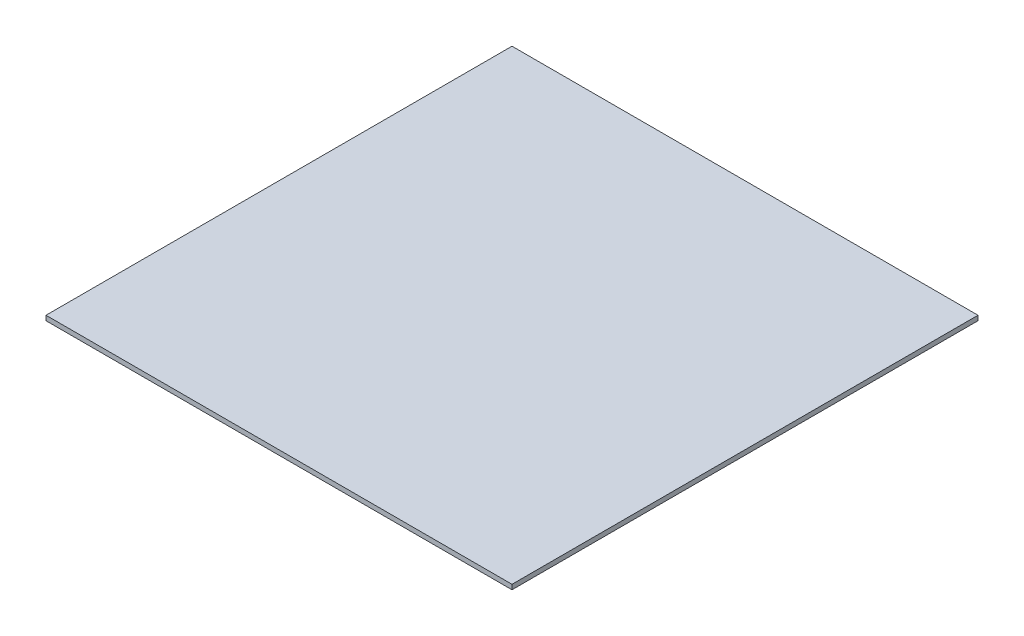
ISO-10303-21;
HEADER;
FILE_DESCRIPTION(('STEP AP214'),'2;1');
FILE_NAME('part.step','',(''),(''),'','','');
FILE_SCHEMA(('AUTOMOTIVE_DESIGN { 1 0 10303 214 1 1 1 1 }'));
ENDSEC;
DATA;
#1=APPLICATION_CONTEXT('core data for automotive mechanical design processes');
#2=APPLICATION_PROTOCOL_DEFINITION('international standard','automotive_design',2000,#1);
#3=PRODUCT_CONTEXT('',#1,'mechanical');
#4=PRODUCT('Part','Part','',(#3));
#5=PRODUCT_RELATED_PRODUCT_CATEGORY('part','',(#4));
#6=PRODUCT_DEFINITION_FORMATION('','',#4);
#7=PRODUCT_DEFINITION_CONTEXT('part definition',#1,'design');
#8=PRODUCT_DEFINITION('design','',#6,#7);
#9=PRODUCT_DEFINITION_SHAPE('','',#8);
#10=(LENGTH_UNIT() NAMED_UNIT(*) SI_UNIT(.MILLI.,.METRE.));
#11=(NAMED_UNIT(*) PLANE_ANGLE_UNIT() SI_UNIT($,.RADIAN.));
#12=(NAMED_UNIT(*) SI_UNIT($,.STERADIAN.) SOLID_ANGLE_UNIT());
#13=UNCERTAINTY_MEASURE_WITH_UNIT(LENGTH_MEASURE(1.E-05),#10,'distance_accuracy_value','');
#14=(GEOMETRIC_REPRESENTATION_CONTEXT(3) GLOBAL_UNCERTAINTY_ASSIGNED_CONTEXT((#13)) GLOBAL_UNIT_ASSIGNED_CONTEXT((#10,
#11,#12)) REPRESENTATION_CONTEXT('',''));
#15=CARTESIAN_POINT('',(0.,0.,0.));
#16=DIRECTION('',(0.,0.,1.));
#17=DIRECTION('',(1.,0.,0.));
#18=AXIS2_PLACEMENT_3D('',#15,#16,#17);
#19=CARTESIAN_POINT('',(-195.,4.,195.));
#20=DIRECTION('',(1.,0.,0.));
#21=DIRECTION('',(0.,0.,-1.));
#22=AXIS2_PLACEMENT_3D('',#19,#20,#21);
#23=PLANE('',#22);
#24=DIRECTION('',(0.,0.,1.));
#25=VECTOR('',#24,1.);
#26=CARTESIAN_POINT('',(-195.,0.,195.));
#27=LINE('',#26,#25);
#28=CARTESIAN_POINT('',(-195.,0.,-195.));
#29=VERTEX_POINT('',#28);
#30=CARTESIAN_POINT('',(-195.,0.,195.));
#31=VERTEX_POINT('',#30);
#32=EDGE_CURVE('E95',#29,#31,#27,.T.);
#33=ORIENTED_EDGE('',*,*,#32,.T.);
#34=DIRECTION('',(0.,-1.,0.));
#35=VECTOR('',#34,1.);
#36=CARTESIAN_POINT('',(-195.,4.,195.));
#37=LINE('',#36,#35);
#38=CARTESIAN_POINT('',(-195.,4.,195.));
#39=VERTEX_POINT('',#38);
#40=EDGE_CURVE('E11',#39,#31,#37,.T.);
#41=ORIENTED_EDGE('',*,*,#40,.F.);
#42=DIRECTION('',(0.,0.,1.));
#43=VECTOR('',#42,1.);
#44=CARTESIAN_POINT('',(-195.,4.,195.));
#45=LINE('',#44,#43);
#46=CARTESIAN_POINT('',(-195.,4.,-195.));
#47=VERTEX_POINT('',#46);
#48=EDGE_CURVE('E83',#47,#39,#45,.T.);
#49=ORIENTED_EDGE('',*,*,#48,.F.);
#50=DIRECTION('',(0.,-1.,0.));
#51=VECTOR('',#50,1.);
#52=CARTESIAN_POINT('',(-195.,4.,-195.));
#53=LINE('',#52,#51);
#54=EDGE_CURVE('E91',#47,#29,#53,.T.);
#55=ORIENTED_EDGE('',*,*,#54,.T.);
#56=EDGE_LOOP('',(#33,#41,#49,#55));
#57=FACE_BOUND('',#56,.T.);
#58=ADVANCED_FACE('F32',(#57),#23,.F.);
#59=CARTESIAN_POINT('',(195.,4.,195.));
#60=DIRECTION('',(0.,0.,-1.));
#61=DIRECTION('',(-1.,0.,0.));
#62=AXIS2_PLACEMENT_3D('',#59,#60,#61);
#63=PLANE('',#62);
#64=DIRECTION('',(1.,0.,0.));
#65=VECTOR('',#64,1.);
#66=CARTESIAN_POINT('',(195.,0.,195.));
#67=LINE('',#66,#65);
#68=CARTESIAN_POINT('',(195.,0.,195.));
#69=VERTEX_POINT('',#68);
#70=EDGE_CURVE('E87',#31,#69,#67,.T.);
#71=ORIENTED_EDGE('',*,*,#70,.T.);
#72=DIRECTION('',(0.,-1.,0.));
#73=VECTOR('',#72,1.);
#74=CARTESIAN_POINT('',(195.,4.,195.));
#75=LINE('',#74,#73);
#76=CARTESIAN_POINT('',(195.,4.,195.));
#77=VERTEX_POINT('',#76);
#78=EDGE_CURVE('E40',#77,#69,#75,.T.);
#79=ORIENTED_EDGE('',*,*,#78,.F.);
#80=DIRECTION('',(1.,0.,0.));
#81=VECTOR('',#80,1.);
#82=CARTESIAN_POINT('',(195.,4.,195.));
#83=LINE('',#82,#81);
#84=EDGE_CURVE('E78',#39,#77,#83,.T.);
#85=ORIENTED_EDGE('',*,*,#84,.F.);
#86=ORIENTED_EDGE('',*,*,#40,.T.);
#87=EDGE_LOOP('',(#71,#79,#85,#86));
#88=FACE_BOUND('',#87,.T.);
#89=ADVANCED_FACE('F86',(#88),#63,.F.);
#90=CARTESIAN_POINT('',(195.,4.,195.));
#91=DIRECTION('',(-1.,0.,0.));
#92=DIRECTION('',(0.,0.,1.));
#93=AXIS2_PLACEMENT_3D('',#90,#91,#92);
#94=PLANE('',#93);
#95=DIRECTION('',(0.,0.,-1.));
#96=VECTOR('',#95,1.);
#97=CARTESIAN_POINT('',(195.,0.,195.));
#98=LINE('',#97,#96);
#99=CARTESIAN_POINT('',(195.,0.,-195.));
#100=VERTEX_POINT('',#99);
#101=EDGE_CURVE('E65',#69,#100,#98,.T.);
#102=ORIENTED_EDGE('',*,*,#101,.T.);
#103=DIRECTION('',(0.,-1.,0.));
#104=VECTOR('',#103,1.);
#105=CARTESIAN_POINT('',(195.,4.,-195.));
#106=LINE('',#105,#104);
#107=CARTESIAN_POINT('',(195.,4.,-195.));
#108=VERTEX_POINT('',#107);
#109=EDGE_CURVE('E88',#108,#100,#106,.T.);
#110=ORIENTED_EDGE('',*,*,#109,.F.);
#111=DIRECTION('',(0.,0.,-1.));
#112=VECTOR('',#111,1.);
#113=CARTESIAN_POINT('',(195.,4.,195.));
#114=LINE('',#113,#112);
#115=EDGE_CURVE('E81',#77,#108,#114,.T.);
#116=ORIENTED_EDGE('',*,*,#115,.F.);
#117=ORIENTED_EDGE('',*,*,#78,.T.);
#118=EDGE_LOOP('',(#102,#110,#116,#117));
#119=FACE_BOUND('',#118,.T.);
#120=ADVANCED_FACE('F89',(#119),#94,.F.);
#121=CARTESIAN_POINT('',(195.,4.,-195.));
#122=DIRECTION('',(0.,0.,1.));
#123=DIRECTION('',(1.,0.,0.));
#124=AXIS2_PLACEMENT_3D('',#121,#122,#123);
#125=PLANE('',#124);
#126=DIRECTION('',(-1.,0.,0.));
#127=VECTOR('',#126,1.);
#128=CARTESIAN_POINT('',(195.,0.,-195.));
#129=LINE('',#128,#127);
#130=EDGE_CURVE('E71',#100,#29,#129,.T.);
#131=ORIENTED_EDGE('',*,*,#130,.T.);
#132=ORIENTED_EDGE('',*,*,#54,.F.);
#133=DIRECTION('',(-1.,0.,0.));
#134=VECTOR('',#133,1.);
#135=CARTESIAN_POINT('',(195.,4.,-195.));
#136=LINE('',#135,#134);
#137=EDGE_CURVE('E48',#108,#47,#136,.T.);
#138=ORIENTED_EDGE('',*,*,#137,.F.);
#139=ORIENTED_EDGE('',*,*,#109,.T.);
#140=EDGE_LOOP('',(#131,#132,#138,#139));
#141=FACE_BOUND('',#140,.T.);
#142=ADVANCED_FACE('F102',(#141),#125,.F.);
#143=CARTESIAN_POINT('',(0.,4.,0.));
#144=DIRECTION('',(0.,1.,0.));
#145=DIRECTION('',(0.,0.,1.));
#146=AXIS2_PLACEMENT_3D('',#143,#144,#145);
#147=PLANE('',#146);
#148=ORIENTED_EDGE('',*,*,#48,.T.);
#149=ORIENTED_EDGE('',*,*,#84,.T.);
#150=ORIENTED_EDGE('',*,*,#115,.T.);
#151=ORIENTED_EDGE('',*,*,#137,.T.);
#152=EDGE_LOOP('',(#148,#149,#150,#151));
#153=FACE_BOUND('',#152,.T.);
#154=ADVANCED_FACE('F79',(#153),#147,.T.);
#155=CARTESIAN_POINT('',(0.,0.,0.));
#156=DIRECTION('',(0.,1.,0.));
#157=DIRECTION('',(0.,0.,1.));
#158=AXIS2_PLACEMENT_3D('',#155,#156,#157);
#159=PLANE('',#158);
#160=ORIENTED_EDGE('',*,*,#32,.F.);
#161=ORIENTED_EDGE('',*,*,#130,.F.);
#162=ORIENTED_EDGE('',*,*,#101,.F.);
#163=ORIENTED_EDGE('',*,*,#70,.F.);
#164=EDGE_LOOP('',(#160,#161,#162,#163));
#165=FACE_BOUND('',#164,.T.);
#166=ADVANCED_FACE('F105',(#165),#159,.F.);
#167=CLOSED_SHELL('',(#58,#89,#120,#142,#154,#166));
#168=MANIFOLD_SOLID_BREP('B2',#167);
#169=ADVANCED_BREP_SHAPE_REPRESENTATION('',(#18,#168),#14);
#170=SHAPE_DEFINITION_REPRESENTATION(#9,#169);
ENDSEC;
END-ISO-10303-21;
